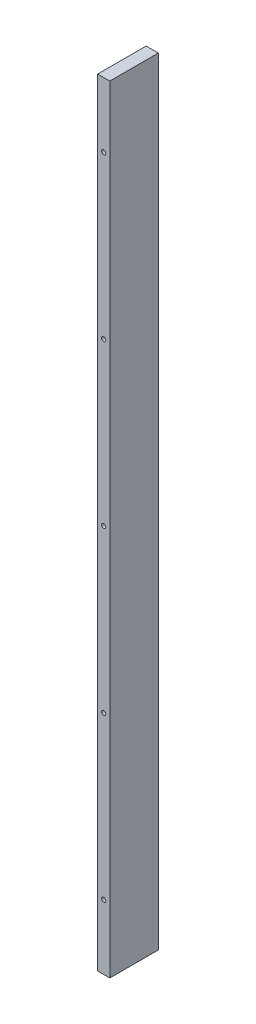
ISO-10303-21;
HEADER;
FILE_DESCRIPTION(('STEP AP214'),'2;1');
FILE_NAME('part.step','',(''),(''),'','','');
FILE_SCHEMA(('AUTOMOTIVE_DESIGN { 1 0 10303 214 1 1 1 1 }'));
ENDSEC;
DATA;
#1=APPLICATION_CONTEXT('core data for automotive mechanical design processes');
#2=APPLICATION_PROTOCOL_DEFINITION('international standard','automotive_design',2000,#1);
#3=PRODUCT_CONTEXT('',#1,'mechanical');
#4=PRODUCT('Part','Part','',(#3));
#5=PRODUCT_RELATED_PRODUCT_CATEGORY('part','',(#4));
#6=PRODUCT_DEFINITION_FORMATION('','',#4);
#7=PRODUCT_DEFINITION_CONTEXT('part definition',#1,'design');
#8=PRODUCT_DEFINITION('design','',#6,#7);
#9=PRODUCT_DEFINITION_SHAPE('','',#8);
#10=(LENGTH_UNIT() NAMED_UNIT(*) SI_UNIT(.MILLI.,.METRE.));
#11=(NAMED_UNIT(*) PLANE_ANGLE_UNIT() SI_UNIT($,.RADIAN.));
#12=(NAMED_UNIT(*) SI_UNIT($,.STERADIAN.) SOLID_ANGLE_UNIT());
#13=UNCERTAINTY_MEASURE_WITH_UNIT(LENGTH_MEASURE(1.E-05),#10,'distance_accuracy_value','');
#14=(GEOMETRIC_REPRESENTATION_CONTEXT(3) GLOBAL_UNCERTAINTY_ASSIGNED_CONTEXT((#13)) GLOBAL_UNIT_ASSIGNED_CONTEXT((#10,
#11,#12)) REPRESENTATION_CONTEXT('',''));
#15=CARTESIAN_POINT('',(0.,0.,0.));
#16=DIRECTION('',(0.,0.,1.));
#17=DIRECTION('',(1.,0.,0.));
#18=AXIS2_PLACEMENT_3D('',#15,#16,#17);
#19=CARTESIAN_POINT('',(19.05,0.,0.));
#20=DIRECTION('',(0.,0.,-1.));
#21=DIRECTION('',(-1.,0.,0.));
#22=AXIS2_PLACEMENT_3D('',#19,#20,#21);
#23=PLANE('',#22);
#24=CARTESIAN_POINT('',(9.525,1117.6,0.));
#25=DIRECTION('',(0.,0.,1.));
#26=DIRECTION('',(1.,0.,0.));
#27=AXIS2_PLACEMENT_3D('',#24,#25,#26);
#28=CIRCLE('',#27,3.2639);
#29=CARTESIAN_POINT('',(12.7889,1117.6,0.));
#30=VERTEX_POINT('',#29);
#31=EDGE_CURVE('E126',#30,#30,#28,.T.);
#32=ORIENTED_EDGE('',*,*,#31,.F.);
#33=EDGE_LOOP('',(#32));
#34=FACE_BOUND('',#33,.T.);
#35=CARTESIAN_POINT('',(9.525,863.6,0.));
#36=DIRECTION('',(0.,0.,1.));
#37=DIRECTION('',(1.,0.,0.));
#38=AXIS2_PLACEMENT_3D('',#35,#36,#37);
#39=CIRCLE('',#38,3.2639);
#40=CARTESIAN_POINT('',(12.7889,863.6,0.));
#41=VERTEX_POINT('',#40);
#42=EDGE_CURVE('E132',#41,#41,#39,.T.);
#43=ORIENTED_EDGE('',*,*,#42,.F.);
#44=EDGE_LOOP('',(#43));
#45=FACE_BOUND('',#44,.T.);
#46=CARTESIAN_POINT('',(9.525,609.6,0.));
#47=DIRECTION('',(0.,0.,1.));
#48=DIRECTION('',(1.,0.,0.));
#49=AXIS2_PLACEMENT_3D('',#46,#47,#48);
#50=CIRCLE('',#49,3.2639);
#51=CARTESIAN_POINT('',(12.7889,609.6,0.));
#52=VERTEX_POINT('',#51);
#53=EDGE_CURVE('E138',#52,#52,#50,.T.);
#54=ORIENTED_EDGE('',*,*,#53,.F.);
#55=EDGE_LOOP('',(#54));
#56=FACE_BOUND('',#55,.T.);
#57=CARTESIAN_POINT('',(9.525,355.6,0.));
#58=DIRECTION('',(0.,0.,1.));
#59=DIRECTION('',(1.,0.,0.));
#60=AXIS2_PLACEMENT_3D('',#57,#58,#59);
#61=CIRCLE('',#60,3.2639);
#62=CARTESIAN_POINT('',(12.7889,355.6,0.));
#63=VERTEX_POINT('',#62);
#64=EDGE_CURVE('E144',#63,#63,#61,.T.);
#65=ORIENTED_EDGE('',*,*,#64,.F.);
#66=EDGE_LOOP('',(#65));
#67=FACE_BOUND('',#66,.T.);
#68=CARTESIAN_POINT('',(9.525,101.6,0.));
#69=DIRECTION('',(0.,0.,1.));
#70=DIRECTION('',(1.,0.,0.));
#71=AXIS2_PLACEMENT_3D('',#68,#69,#70);
#72=CIRCLE('',#71,3.2639);
#73=CARTESIAN_POINT('',(12.7889,101.6,0.));
#74=VERTEX_POINT('',#73);
#75=EDGE_CURVE('E150',#74,#74,#72,.T.);
#76=ORIENTED_EDGE('',*,*,#75,.F.);
#77=EDGE_LOOP('',(#76));
#78=FACE_BOUND('',#77,.T.);
#79=DIRECTION('',(0.,-1.,0.));
#80=VECTOR('',#79,1.);
#81=CARTESIAN_POINT('',(0.,0.,0.));
#82=LINE('',#81,#80);
#83=CARTESIAN_POINT('',(0.,1219.2,0.));
#84=VERTEX_POINT('',#83);
#85=CARTESIAN_POINT('',(0.,0.,0.));
#86=VERTEX_POINT('',#85);
#87=EDGE_CURVE('E153',#84,#86,#82,.T.);
#88=ORIENTED_EDGE('',*,*,#87,.T.);
#89=DIRECTION('',(-1.,0.,0.));
#90=VECTOR('',#89,1.);
#91=CARTESIAN_POINT('',(19.05,0.,0.));
#92=LINE('',#91,#90);
#93=CARTESIAN_POINT('',(19.05,0.,0.));
#94=VERTEX_POINT('',#93);
#95=EDGE_CURVE('E11',#94,#86,#92,.T.);
#96=ORIENTED_EDGE('',*,*,#95,.F.);
#97=DIRECTION('',(0.,-1.,0.));
#98=VECTOR('',#97,1.);
#99=CARTESIAN_POINT('',(19.05,0.,0.));
#100=LINE('',#99,#98);
#101=CARTESIAN_POINT('',(19.05,1219.2,0.));
#102=VERTEX_POINT('',#101);
#103=EDGE_CURVE('E162',#102,#94,#100,.T.);
#104=ORIENTED_EDGE('',*,*,#103,.F.);
#105=DIRECTION('',(-1.,0.,0.));
#106=VECTOR('',#105,1.);
#107=CARTESIAN_POINT('',(19.05,1219.2,0.));
#108=LINE('',#107,#106);
#109=EDGE_CURVE('E168',#102,#84,#108,.T.);
#110=ORIENTED_EDGE('',*,*,#109,.T.);
#111=EDGE_LOOP('',(#88,#96,#104,#110));
#112=FACE_BOUND('',#111,.T.);
#113=ADVANCED_FACE('F44',(#34,#45,#56,#67,#78,#112),#23,.F.);
#114=CARTESIAN_POINT('',(19.05,0.,0.));
#115=DIRECTION('',(0.,1.,0.));
#116=DIRECTION('',(0.,0.,1.));
#117=AXIS2_PLACEMENT_3D('',#114,#115,#116);
#118=PLANE('',#117);
#119=CARTESIAN_POINT('',(9.525,0.,-63.5));
#120=DIRECTION('',(0.,-1.,0.));
#121=DIRECTION('',(0.,0.,-1.));
#122=AXIS2_PLACEMENT_3D('',#119,#120,#121);
#123=CIRCLE('',#122,3.26389999999999);
#124=CARTESIAN_POINT('',(9.525,0.,-66.7639));
#125=VERTEX_POINT('',#124);
#126=EDGE_CURVE('E112',#125,#125,#123,.T.);
#127=ORIENTED_EDGE('',*,*,#126,.F.);
#128=EDGE_LOOP('',(#127));
#129=FACE_BOUND('',#128,.T.);
#130=CARTESIAN_POINT('',(9.525,0.,-12.7));
#131=DIRECTION('',(0.,-1.,0.));
#132=DIRECTION('',(0.,0.,-1.));
#133=AXIS2_PLACEMENT_3D('',#130,#131,#132);
#134=CIRCLE('',#133,3.26389999999999);
#135=CARTESIAN_POINT('',(9.525,0.,-15.9639));
#136=VERTEX_POINT('',#135);
#137=EDGE_CURVE('E120',#136,#136,#134,.T.);
#138=ORIENTED_EDGE('',*,*,#137,.F.);
#139=EDGE_LOOP('',(#138));
#140=FACE_BOUND('',#139,.T.);
#141=DIRECTION('',(0.,0.,-1.));
#142=VECTOR('',#141,1.);
#143=CARTESIAN_POINT('',(0.,0.,0.));
#144=LINE('',#143,#142);
#145=CARTESIAN_POINT('',(0.,0.,-76.2));
#146=VERTEX_POINT('',#145);
#147=EDGE_CURVE('E156',#86,#146,#144,.T.);
#148=ORIENTED_EDGE('',*,*,#147,.T.);
#149=DIRECTION('',(-1.,0.,0.));
#150=VECTOR('',#149,1.);
#151=CARTESIAN_POINT('',(19.05,0.,-76.2));
#152=LINE('',#151,#150);
#153=CARTESIAN_POINT('',(19.05,0.,-76.2));
#154=VERTEX_POINT('',#153);
#155=EDGE_CURVE('E51',#154,#146,#152,.T.);
#156=ORIENTED_EDGE('',*,*,#155,.F.);
#157=DIRECTION('',(0.,0.,-1.));
#158=VECTOR('',#157,1.);
#159=CARTESIAN_POINT('',(19.05,0.,0.));
#160=LINE('',#159,#158);
#161=EDGE_CURVE('E164',#94,#154,#160,.T.);
#162=ORIENTED_EDGE('',*,*,#161,.F.);
#163=ORIENTED_EDGE('',*,*,#95,.T.);
#164=EDGE_LOOP('',(#148,#156,#162,#163));
#165=FACE_BOUND('',#164,.T.);
#166=ADVANCED_FACE('F189',(#129,#140,#165),#118,.F.);
#167=CARTESIAN_POINT('',(19.05,0.,-76.2));
#168=DIRECTION('',(0.,0.,1.));
#169=DIRECTION('',(1.,0.,0.));
#170=AXIS2_PLACEMENT_3D('',#167,#168,#169);
#171=PLANE('',#170);
#172=DIRECTION('',(0.,1.,0.));
#173=VECTOR('',#172,1.);
#174=CARTESIAN_POINT('',(0.,0.,-76.2));
#175=LINE('',#174,#173);
#176=CARTESIAN_POINT('',(0.,1219.2,-76.2));
#177=VERTEX_POINT('',#176);
#178=EDGE_CURVE('E158',#146,#177,#175,.T.);
#179=ORIENTED_EDGE('',*,*,#178,.T.);
#180=DIRECTION('',(-1.,0.,0.));
#181=VECTOR('',#180,1.);
#182=CARTESIAN_POINT('',(19.05,1219.2,-76.2));
#183=LINE('',#182,#181);
#184=CARTESIAN_POINT('',(19.05,1219.2,-76.2));
#185=VERTEX_POINT('',#184);
#186=EDGE_CURVE('E171',#185,#177,#183,.T.);
#187=ORIENTED_EDGE('',*,*,#186,.F.);
#188=DIRECTION('',(0.,1.,0.));
#189=VECTOR('',#188,1.);
#190=CARTESIAN_POINT('',(19.05,0.,-76.2));
#191=LINE('',#190,#189);
#192=EDGE_CURVE('E63',#154,#185,#191,.T.);
#193=ORIENTED_EDGE('',*,*,#192,.F.);
#194=ORIENTED_EDGE('',*,*,#155,.T.);
#195=EDGE_LOOP('',(#179,#187,#193,#194));
#196=FACE_BOUND('',#195,.T.);
#197=ADVANCED_FACE('F177',(#196),#171,.F.);
#198=CARTESIAN_POINT('',(19.05,1219.2,0.));
#199=DIRECTION('',(0.,-1.,0.));
#200=DIRECTION('',(0.,0.,-1.));
#201=AXIS2_PLACEMENT_3D('',#198,#199,#200);
#202=PLANE('',#201);
#203=DIRECTION('',(0.,0.,1.));
#204=VECTOR('',#203,1.);
#205=CARTESIAN_POINT('',(0.,1219.2,0.));
#206=LINE('',#205,#204);
#207=EDGE_CURVE('E160',#177,#84,#206,.T.);
#208=ORIENTED_EDGE('',*,*,#207,.T.);
#209=ORIENTED_EDGE('',*,*,#109,.F.);
#210=DIRECTION('',(0.,0.,1.));
#211=VECTOR('',#210,1.);
#212=CARTESIAN_POINT('',(19.05,1219.2,0.));
#213=LINE('',#212,#211);
#214=EDGE_CURVE('E58',#185,#102,#213,.T.);
#215=ORIENTED_EDGE('',*,*,#214,.F.);
#216=ORIENTED_EDGE('',*,*,#186,.T.);
#217=EDGE_LOOP('',(#208,#209,#215,#216));
#218=FACE_BOUND('',#217,.T.);
#219=ADVANCED_FACE('F184',(#218),#202,.F.);
#220=CARTESIAN_POINT('',(19.05,1219.2,0.));
#221=DIRECTION('',(-1.,0.,0.));
#222=DIRECTION('',(0.,0.,1.));
#223=AXIS2_PLACEMENT_3D('',#220,#221,#222);
#224=PLANE('',#223);
#225=ORIENTED_EDGE('',*,*,#103,.T.);
#226=ORIENTED_EDGE('',*,*,#161,.T.);
#227=ORIENTED_EDGE('',*,*,#192,.T.);
#228=ORIENTED_EDGE('',*,*,#214,.T.);
#229=EDGE_LOOP('',(#225,#226,#227,#228));
#230=FACE_BOUND('',#229,.T.);
#231=ADVANCED_FACE('F188',(#230),#224,.F.);
#232=CARTESIAN_POINT('',(0.,1219.2,0.));
#233=DIRECTION('',(-1.,0.,0.));
#234=DIRECTION('',(0.,0.,1.));
#235=AXIS2_PLACEMENT_3D('',#232,#233,#234);
#236=PLANE('',#235);
#237=ORIENTED_EDGE('',*,*,#87,.F.);
#238=ORIENTED_EDGE('',*,*,#207,.F.);
#239=ORIENTED_EDGE('',*,*,#178,.F.);
#240=ORIENTED_EDGE('',*,*,#147,.F.);
#241=EDGE_LOOP('',(#237,#238,#239,#240));
#242=FACE_BOUND('',#241,.T.);
#243=ADVANCED_FACE('F182',(#242),#236,.T.);
#244=CARTESIAN_POINT('',(9.525,101.6,0.));
#245=DIRECTION('',(0.,0.,1.));
#246=DIRECTION('',(1.,0.,0.));
#247=AXIS2_PLACEMENT_3D('',#244,#245,#246);
#248=CYLINDRICAL_SURFACE('',#247,3.2639);
#249=CARTESIAN_POINT('',(9.525,101.6,-22.86));
#250=DIRECTION('',(0.,0.,1.));
#251=DIRECTION('',(1.,0.,0.));
#252=AXIS2_PLACEMENT_3D('',#249,#250,#251);
#253=CIRCLE('',#252,3.2639);
#254=CARTESIAN_POINT('',(12.7889,101.6,-22.86));
#255=VERTEX_POINT('',#254);
#256=EDGE_CURVE('E147',#255,#255,#253,.T.);
#257=ORIENTED_EDGE('',*,*,#256,.F.);
#258=EDGE_LOOP('',(#257));
#259=FACE_BOUND('',#258,.T.);
#260=ORIENTED_EDGE('',*,*,#75,.T.);
#261=EDGE_LOOP('',(#260));
#262=FACE_BOUND('',#261,.T.);
#263=ADVANCED_FACE('F207',(#259,#262),#248,.F.);
#264=CARTESIAN_POINT('',(9.525,101.6,-22.86));
#265=DIRECTION('',(0.,0.,1.));
#266=DIRECTION('',(1.,0.,0.));
#267=AXIS2_PLACEMENT_3D('',#264,#265,#266);
#268=CONICAL_SURFACE('',#267,3.2639,1.02974425867665);
#269=CARTESIAN_POINT('',(9.52499999999999,101.6,-24.8211489744441));
#270=VERTEX_POINT('',#269);
#271=VERTEX_LOOP('',#270);
#272=FACE_BOUND('',#271,.T.);
#273=ORIENTED_EDGE('',*,*,#256,.T.);
#274=EDGE_LOOP('',(#273));
#275=FACE_BOUND('',#274,.T.);
#276=ADVANCED_FACE('F210',(#272,#275),#268,.F.);
#277=CARTESIAN_POINT('',(9.525,355.6,0.));
#278=DIRECTION('',(0.,0.,1.));
#279=DIRECTION('',(1.,0.,0.));
#280=AXIS2_PLACEMENT_3D('',#277,#278,#279);
#281=CYLINDRICAL_SURFACE('',#280,3.2639);
#282=CARTESIAN_POINT('',(9.525,355.6,-22.86));
#283=DIRECTION('',(0.,0.,1.));
#284=DIRECTION('',(1.,0.,0.));
#285=AXIS2_PLACEMENT_3D('',#282,#283,#284);
#286=CIRCLE('',#285,3.2639);
#287=CARTESIAN_POINT('',(12.7889,355.6,-22.86));
#288=VERTEX_POINT('',#287);
#289=EDGE_CURVE('E141',#288,#288,#286,.T.);
#290=ORIENTED_EDGE('',*,*,#289,.F.);
#291=EDGE_LOOP('',(#290));
#292=FACE_BOUND('',#291,.T.);
#293=ORIENTED_EDGE('',*,*,#64,.T.);
#294=EDGE_LOOP('',(#293));
#295=FACE_BOUND('',#294,.T.);
#296=ADVANCED_FACE('F214',(#292,#295),#281,.F.);
#297=CARTESIAN_POINT('',(9.525,355.6,-22.86));
#298=DIRECTION('',(0.,0.,1.));
#299=DIRECTION('',(1.,0.,0.));
#300=AXIS2_PLACEMENT_3D('',#297,#298,#299);
#301=CONICAL_SURFACE('',#300,3.2639,1.02974425867665);
#302=CARTESIAN_POINT('',(9.52499999999999,355.6,-24.8211489744441));
#303=VERTEX_POINT('',#302);
#304=VERTEX_LOOP('',#303);
#305=FACE_BOUND('',#304,.T.);
#306=ORIENTED_EDGE('',*,*,#289,.T.);
#307=EDGE_LOOP('',(#306));
#308=FACE_BOUND('',#307,.T.);
#309=ADVANCED_FACE('F218',(#305,#308),#301,.F.);
#310=CARTESIAN_POINT('',(9.525,609.6,0.));
#311=DIRECTION('',(0.,0.,1.));
#312=DIRECTION('',(1.,0.,0.));
#313=AXIS2_PLACEMENT_3D('',#310,#311,#312);
#314=CYLINDRICAL_SURFACE('',#313,3.2639);
#315=CARTESIAN_POINT('',(9.525,609.6,-22.86));
#316=DIRECTION('',(0.,0.,1.));
#317=DIRECTION('',(1.,0.,0.));
#318=AXIS2_PLACEMENT_3D('',#315,#316,#317);
#319=CIRCLE('',#318,3.2639);
#320=CARTESIAN_POINT('',(12.7889,609.6,-22.86));
#321=VERTEX_POINT('',#320);
#322=EDGE_CURVE('E135',#321,#321,#319,.T.);
#323=ORIENTED_EDGE('',*,*,#322,.F.);
#324=EDGE_LOOP('',(#323));
#325=FACE_BOUND('',#324,.T.);
#326=ORIENTED_EDGE('',*,*,#53,.T.);
#327=EDGE_LOOP('',(#326));
#328=FACE_BOUND('',#327,.T.);
#329=ADVANCED_FACE('F222',(#325,#328),#314,.F.);
#330=CARTESIAN_POINT('',(9.525,609.6,-22.86));
#331=DIRECTION('',(0.,0.,1.));
#332=DIRECTION('',(1.,0.,0.));
#333=AXIS2_PLACEMENT_3D('',#330,#331,#332);
#334=CONICAL_SURFACE('',#333,3.2639,1.02974425867665);
#335=CARTESIAN_POINT('',(9.52499999999999,609.6,-24.8211489744441));
#336=VERTEX_POINT('',#335);
#337=VERTEX_LOOP('',#336);
#338=FACE_BOUND('',#337,.T.);
#339=ORIENTED_EDGE('',*,*,#322,.T.);
#340=EDGE_LOOP('',(#339));
#341=FACE_BOUND('',#340,.T.);
#342=ADVANCED_FACE('F226',(#338,#341),#334,.F.);
#343=CARTESIAN_POINT('',(9.525,863.6,0.));
#344=DIRECTION('',(0.,0.,1.));
#345=DIRECTION('',(1.,0.,0.));
#346=AXIS2_PLACEMENT_3D('',#343,#344,#345);
#347=CYLINDRICAL_SURFACE('',#346,3.2639);
#348=CARTESIAN_POINT('',(9.525,863.6,-22.86));
#349=DIRECTION('',(0.,0.,1.));
#350=DIRECTION('',(1.,0.,0.));
#351=AXIS2_PLACEMENT_3D('',#348,#349,#350);
#352=CIRCLE('',#351,3.2639);
#353=CARTESIAN_POINT('',(12.7889,863.6,-22.86));
#354=VERTEX_POINT('',#353);
#355=EDGE_CURVE('E129',#354,#354,#352,.T.);
#356=ORIENTED_EDGE('',*,*,#355,.F.);
#357=EDGE_LOOP('',(#356));
#358=FACE_BOUND('',#357,.T.);
#359=ORIENTED_EDGE('',*,*,#42,.T.);
#360=EDGE_LOOP('',(#359));
#361=FACE_BOUND('',#360,.T.);
#362=ADVANCED_FACE('F230',(#358,#361),#347,.F.);
#363=CARTESIAN_POINT('',(9.525,863.6,-22.86));
#364=DIRECTION('',(0.,0.,1.));
#365=DIRECTION('',(1.,0.,0.));
#366=AXIS2_PLACEMENT_3D('',#363,#364,#365);
#367=CONICAL_SURFACE('',#366,3.2639,1.02974425867665);
#368=CARTESIAN_POINT('',(9.52499999999999,863.6,-24.8211489744441));
#369=VERTEX_POINT('',#368);
#370=VERTEX_LOOP('',#369);
#371=FACE_BOUND('',#370,.T.);
#372=ORIENTED_EDGE('',*,*,#355,.T.);
#373=EDGE_LOOP('',(#372));
#374=FACE_BOUND('',#373,.T.);
#375=ADVANCED_FACE('F234',(#371,#374),#367,.F.);
#376=CARTESIAN_POINT('',(9.525,1117.6,0.));
#377=DIRECTION('',(0.,0.,1.));
#378=DIRECTION('',(1.,0.,0.));
#379=AXIS2_PLACEMENT_3D('',#376,#377,#378);
#380=CYLINDRICAL_SURFACE('',#379,3.2639);
#381=CARTESIAN_POINT('',(9.525,1117.6,-22.86));
#382=DIRECTION('',(0.,0.,1.));
#383=DIRECTION('',(1.,0.,0.));
#384=AXIS2_PLACEMENT_3D('',#381,#382,#383);
#385=CIRCLE('',#384,3.2639);
#386=CARTESIAN_POINT('',(12.7889,1117.6,-22.86));
#387=VERTEX_POINT('',#386);
#388=EDGE_CURVE('E123',#387,#387,#385,.T.);
#389=ORIENTED_EDGE('',*,*,#388,.F.);
#390=EDGE_LOOP('',(#389));
#391=FACE_BOUND('',#390,.T.);
#392=ORIENTED_EDGE('',*,*,#31,.T.);
#393=EDGE_LOOP('',(#392));
#394=FACE_BOUND('',#393,.T.);
#395=ADVANCED_FACE('F238',(#391,#394),#380,.F.);
#396=CARTESIAN_POINT('',(9.525,1117.6,-22.86));
#397=DIRECTION('',(0.,0.,1.));
#398=DIRECTION('',(1.,0.,0.));
#399=AXIS2_PLACEMENT_3D('',#396,#397,#398);
#400=CONICAL_SURFACE('',#399,3.2639,1.02974425867665);
#401=CARTESIAN_POINT('',(9.52499999999999,1117.6,-24.8211489744441));
#402=VERTEX_POINT('',#401);
#403=VERTEX_LOOP('',#402);
#404=FACE_BOUND('',#403,.T.);
#405=ORIENTED_EDGE('',*,*,#388,.T.);
#406=EDGE_LOOP('',(#405));
#407=FACE_BOUND('',#406,.T.);
#408=ADVANCED_FACE('F242',(#404,#407),#400,.F.);
#409=CARTESIAN_POINT('',(9.525,0.,-12.7));
#410=DIRECTION('',(0.,-1.,0.));
#411=DIRECTION('',(0.,0.,-1.));
#412=AXIS2_PLACEMENT_3D('',#409,#410,#411);
#413=CYLINDRICAL_SURFACE('',#412,3.26389999999999);
#414=CARTESIAN_POINT('',(9.525,22.86,-12.7));
#415=DIRECTION('',(0.,-1.,0.));
#416=DIRECTION('',(0.,0.,-1.));
#417=AXIS2_PLACEMENT_3D('',#414,#415,#416);
#418=CIRCLE('',#417,3.2639);
#419=CARTESIAN_POINT('',(9.525,22.86,-15.9639));
#420=VERTEX_POINT('',#419);
#421=EDGE_CURVE('E115',#420,#420,#418,.T.);
#422=ORIENTED_EDGE('',*,*,#421,.F.);
#423=EDGE_LOOP('',(#422));
#424=FACE_BOUND('',#423,.T.);
#425=ORIENTED_EDGE('',*,*,#137,.T.);
#426=EDGE_LOOP('',(#425));
#427=FACE_BOUND('',#426,.T.);
#428=ADVANCED_FACE('F246',(#424,#427),#413,.F.);
#429=CARTESIAN_POINT('',(9.525,22.86,-12.7));
#430=DIRECTION('',(0.,-1.,0.));
#431=DIRECTION('',(0.,0.,-1.));
#432=AXIS2_PLACEMENT_3D('',#429,#430,#431);
#433=CONICAL_SURFACE('',#432,3.2639,1.02974425867665);
#434=CARTESIAN_POINT('',(9.52499999999999,24.8211489744441,-12.7));
#435=VERTEX_POINT('',#434);
#436=VERTEX_LOOP('',#435);
#437=FACE_BOUND('',#436,.T.);
#438=ORIENTED_EDGE('',*,*,#421,.T.);
#439=EDGE_LOOP('',(#438));
#440=FACE_BOUND('',#439,.T.);
#441=ADVANCED_FACE('F250',(#437,#440),#433,.F.);
#442=CARTESIAN_POINT('',(9.525,0.,-63.5));
#443=DIRECTION('',(0.,-1.,0.));
#444=DIRECTION('',(0.,0.,-1.));
#445=AXIS2_PLACEMENT_3D('',#442,#443,#444);
#446=CYLINDRICAL_SURFACE('',#445,3.26389999999999);
#447=CARTESIAN_POINT('',(9.525,22.86,-63.5));
#448=DIRECTION('',(0.,-1.,0.));
#449=DIRECTION('',(0.,0.,-1.));
#450=AXIS2_PLACEMENT_3D('',#447,#448,#449);
#451=CIRCLE('',#450,3.2639);
#452=CARTESIAN_POINT('',(9.525,22.86,-66.7639));
#453=VERTEX_POINT('',#452);
#454=EDGE_CURVE('E110',#453,#453,#451,.T.);
#455=ORIENTED_EDGE('',*,*,#454,.F.);
#456=EDGE_LOOP('',(#455));
#457=FACE_BOUND('',#456,.T.);
#458=ORIENTED_EDGE('',*,*,#126,.T.);
#459=EDGE_LOOP('',(#458));
#460=FACE_BOUND('',#459,.T.);
#461=ADVANCED_FACE('F106',(#457,#460),#446,.F.);
#462=CARTESIAN_POINT('',(9.525,22.86,-63.5));
#463=DIRECTION('',(0.,-1.,0.));
#464=DIRECTION('',(0.,0.,-1.));
#465=AXIS2_PLACEMENT_3D('',#462,#463,#464);
#466=CONICAL_SURFACE('',#465,3.2639,1.02974425867665);
#467=CARTESIAN_POINT('',(9.52499999999999,24.8211489744441,-63.5));
#468=VERTEX_POINT('',#467);
#469=VERTEX_LOOP('',#468);
#470=FACE_BOUND('',#469,.T.);
#471=ORIENTED_EDGE('',*,*,#454,.T.);
#472=EDGE_LOOP('',(#471));
#473=FACE_BOUND('',#472,.T.);
#474=ADVANCED_FACE('F103',(#470,#473),#466,.F.);
#475=CLOSED_SHELL('',(#113,#166,#197,#219,#231,#243,#263,#276,#296,#309,#329,#342,#362,#375,
#395,#408,#428,#441,#461,#474));
#476=MANIFOLD_SOLID_BREP('B2',#475);
#477=ADVANCED_BREP_SHAPE_REPRESENTATION('',(#18,#476),#14);
#478=SHAPE_DEFINITION_REPRESENTATION(#9,#477);
ENDSEC;
END-ISO-10303-21;
